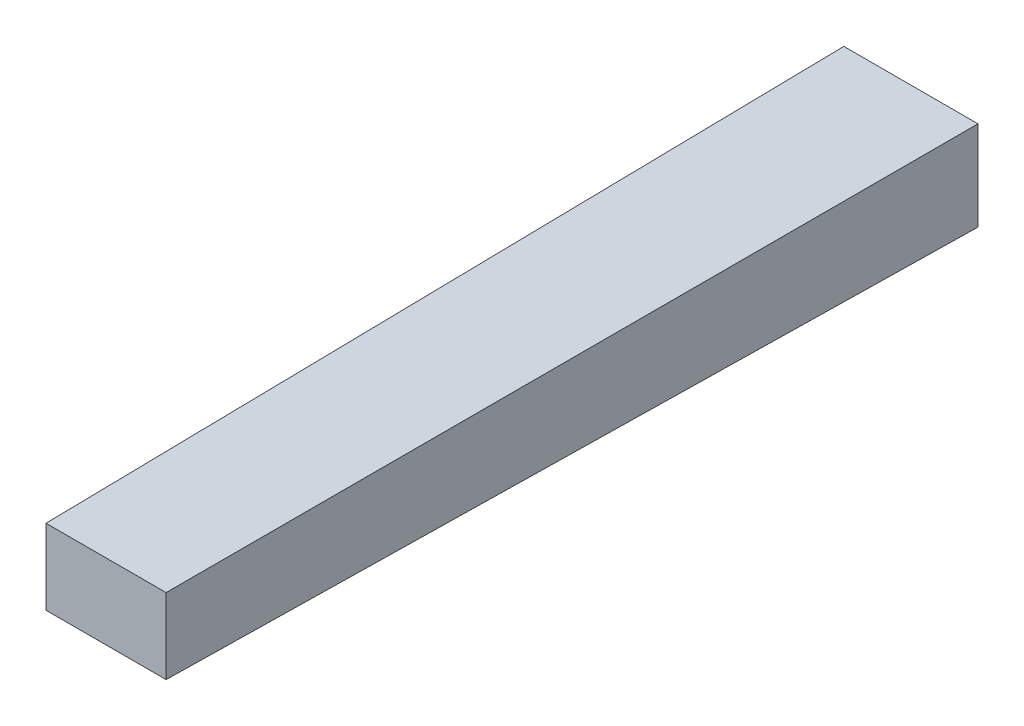
ISO-10303-21;
HEADER;
FILE_DESCRIPTION(('STEP AP214'),'2;1');
FILE_NAME('part.step','',(''),(''),'','','');
FILE_SCHEMA(('AUTOMOTIVE_DESIGN { 1 0 10303 214 1 1 1 1 }'));
ENDSEC;
DATA;
#1=APPLICATION_CONTEXT('core data for automotive mechanical design processes');
#2=APPLICATION_PROTOCOL_DEFINITION('international standard','automotive_design',2000,#1);
#3=PRODUCT_CONTEXT('',#1,'mechanical');
#4=PRODUCT('Part','Part','',(#3));
#5=PRODUCT_RELATED_PRODUCT_CATEGORY('part','',(#4));
#6=PRODUCT_DEFINITION_FORMATION('','',#4);
#7=PRODUCT_DEFINITION_CONTEXT('part definition',#1,'design');
#8=PRODUCT_DEFINITION('design','',#6,#7);
#9=PRODUCT_DEFINITION_SHAPE('','',#8);
#10=(LENGTH_UNIT() NAMED_UNIT(*) SI_UNIT(.MILLI.,.METRE.));
#11=(NAMED_UNIT(*) PLANE_ANGLE_UNIT() SI_UNIT($,.RADIAN.));
#12=(NAMED_UNIT(*) SI_UNIT($,.STERADIAN.) SOLID_ANGLE_UNIT());
#13=UNCERTAINTY_MEASURE_WITH_UNIT(LENGTH_MEASURE(1.E-05),#10,'distance_accuracy_value','');
#14=(GEOMETRIC_REPRESENTATION_CONTEXT(3) GLOBAL_UNCERTAINTY_ASSIGNED_CONTEXT((#13)) GLOBAL_UNIT_ASSIGNED_CONTEXT((#10,
#11,#12)) REPRESENTATION_CONTEXT('',''));
#15=CARTESIAN_POINT('',(0.,0.,0.));
#16=DIRECTION('',(0.,0.,1.));
#17=DIRECTION('',(1.,0.,0.));
#18=AXIS2_PLACEMENT_3D('',#15,#16,#17);
#19=CARTESIAN_POINT('',(0.,0.,0.));
#20=DIRECTION('',(-0.999961923064171,0.,0.00872653549837395));
#21=DIRECTION('',(0.00872653549837395,0.,0.999961923064171));
#22=AXIS2_PLACEMENT_3D('',#19,#20,#21);
#23=PLANE('',#22);
#24=DIRECTION('',(0.,-1.,0.));
#25=VECTOR('',#24,1.);
#26=CARTESIAN_POINT('',(0.,0.,0.));
#27=LINE('',#26,#25);
#28=CARTESIAN_POINT('',(0.,6.,0.));
#29=VERTEX_POINT('',#28);
#30=CARTESIAN_POINT('',(0.,0.,0.));
#31=VERTEX_POINT('',#30);
#32=EDGE_CURVE('E90',#29,#31,#27,.T.);
#33=ORIENTED_EDGE('',*,*,#32,.T.);
#34=DIRECTION('',(-0.00872620324394424,-0.00872620324394424,-0.99992385047757));
#35=VECTOR('',#34,1.);
#36=CARTESIAN_POINT('',(0.,0.,0.));
#37=LINE('',#36,#35);
#38=CARTESIAN_POINT('',(0.471250860700976,0.471250860700976,54.));
#39=VERTEX_POINT('',#38);
#40=EDGE_CURVE('E11',#39,#31,#37,.T.);
#41=ORIENTED_EDGE('',*,*,#40,.F.);
#42=DIRECTION('',(0.,1.,0.));
#43=VECTOR('',#42,1.);
#44=CARTESIAN_POINT('',(0.471250860700976,0.,54.));
#45=LINE('',#44,#43);
#46=CARTESIAN_POINT('',(0.471250860700976,5.52874913929903,54.));
#47=VERTEX_POINT('',#46);
#48=EDGE_CURVE('E110',#47,#39,#45,.F.);
#49=ORIENTED_EDGE('',*,*,#48,.F.);
#50=DIRECTION('',(-0.00872620324394424,0.00872620324394424,-0.99992385047757));
#51=VECTOR('',#50,1.);
#52=CARTESIAN_POINT('',(0.000456879738327737,5.99954312026167,0.0523532324864075));
#53=LINE('',#52,#51);
#54=EDGE_CURVE('E102',#47,#29,#53,.T.);
#55=ORIENTED_EDGE('',*,*,#54,.T.);
#56=EDGE_LOOP('',(#33,#41,#49,#55));
#57=FACE_BOUND('',#56,.T.);
#58=ADVANCED_FACE('F43',(#57),#23,.T.);
#59=CARTESIAN_POINT('',(0.,0.,0.));
#60=DIRECTION('',(0.,-0.999961923064171,0.00872653549837395));
#61=DIRECTION('',(0.,-0.00872653549837395,-0.999961923064171));
#62=AXIS2_PLACEMENT_3D('',#59,#60,#61);
#63=PLANE('',#62);
#64=DIRECTION('',(1.,0.,0.));
#65=VECTOR('',#64,1.);
#66=CARTESIAN_POINT('',(0.,0.,0.));
#67=LINE('',#66,#65);
#68=CARTESIAN_POINT('',(9.,0.,0.));
#69=VERTEX_POINT('',#68);
#70=EDGE_CURVE('E86',#31,#69,#67,.T.);
#71=ORIENTED_EDGE('',*,*,#70,.T.);
#72=DIRECTION('',(0.00872620324394424,-0.00872620324394424,-0.99992385047757));
#73=VECTOR('',#72,1.);
#74=CARTESIAN_POINT('',(9.,0.,0.));
#75=LINE('',#74,#73);
#76=CARTESIAN_POINT('',(8.52874913929902,0.471250860700976,54.));
#77=VERTEX_POINT('',#76);
#78=EDGE_CURVE('E53',#77,#69,#75,.T.);
#79=ORIENTED_EDGE('',*,*,#78,.F.);
#80=DIRECTION('',(-1.,0.,0.));
#81=VECTOR('',#80,1.);
#82=CARTESIAN_POINT('',(0.,0.471250860700976,54.));
#83=LINE('',#82,#81);
#84=EDGE_CURVE('E98',#39,#77,#83,.F.);
#85=ORIENTED_EDGE('',*,*,#84,.F.);
#86=ORIENTED_EDGE('',*,*,#40,.T.);
#87=EDGE_LOOP('',(#71,#79,#85,#86));
#88=FACE_BOUND('',#87,.T.);
#89=ADVANCED_FACE('F45',(#88),#63,.T.);
#90=CARTESIAN_POINT('',(9.,0.,0.));
#91=DIRECTION('',(0.999961923064171,0.,0.00872653549837395));
#92=DIRECTION('',(0.00872653549837395,0.,-0.999961923064171));
#93=AXIS2_PLACEMENT_3D('',#90,#91,#92);
#94=PLANE('',#93);
#95=DIRECTION('',(0.,1.,0.));
#96=VECTOR('',#95,1.);
#97=CARTESIAN_POINT('',(9.,0.,0.));
#98=LINE('',#97,#96);
#99=CARTESIAN_POINT('',(9.,6.,0.));
#100=VERTEX_POINT('',#99);
#101=EDGE_CURVE('E91',#69,#100,#98,.T.);
#102=ORIENTED_EDGE('',*,*,#101,.T.);
#103=DIRECTION('',(0.00872620324394424,0.00872620324394424,-0.99992385047757));
#104=VECTOR('',#103,1.);
#105=CARTESIAN_POINT('',(8.99931468039251,5.99931468039251,0.0785298487296113));
#106=LINE('',#105,#104);
#107=CARTESIAN_POINT('',(8.52874913929902,5.52874913929903,54.));
#108=VERTEX_POINT('',#107);
#109=EDGE_CURVE('E114',#108,#100,#106,.T.);
#110=ORIENTED_EDGE('',*,*,#109,.F.);
#111=DIRECTION('',(0.,-1.,0.));
#112=VECTOR('',#111,1.);
#113=CARTESIAN_POINT('',(8.52874913929902,0.,54.));
#114=LINE('',#113,#112);
#115=EDGE_CURVE('E65',#77,#108,#114,.F.);
#116=ORIENTED_EDGE('',*,*,#115,.F.);
#117=ORIENTED_EDGE('',*,*,#78,.T.);
#118=EDGE_LOOP('',(#102,#110,#116,#117));
#119=FACE_BOUND('',#118,.T.);
#120=ADVANCED_FACE('F127',(#119),#94,.T.);
#121=CARTESIAN_POINT('',(0.,6.,0.));
#122=DIRECTION('',(0.,0.999961923064171,0.00872653549837395));
#123=DIRECTION('',(0.,-0.00872653549837395,0.999961923064171));
#124=AXIS2_PLACEMENT_3D('',#121,#122,#123);
#125=PLANE('',#124);
#126=DIRECTION('',(-1.,0.,0.));
#127=VECTOR('',#126,1.);
#128=CARTESIAN_POINT('',(0.,6.,0.));
#129=LINE('',#128,#127);
#130=EDGE_CURVE('E108',#100,#29,#129,.T.);
#131=ORIENTED_EDGE('',*,*,#130,.T.);
#132=ORIENTED_EDGE('',*,*,#54,.F.);
#133=DIRECTION('',(1.,0.,0.));
#134=VECTOR('',#133,1.);
#135=CARTESIAN_POINT('',(0.,5.52874913929903,54.));
#136=LINE('',#135,#134);
#137=EDGE_CURVE('E47',#108,#47,#136,.F.);
#138=ORIENTED_EDGE('',*,*,#137,.F.);
#139=ORIENTED_EDGE('',*,*,#109,.T.);
#140=EDGE_LOOP('',(#131,#132,#138,#139));
#141=FACE_BOUND('',#140,.T.);
#142=ADVANCED_FACE('F129',(#141),#125,.T.);
#143=CARTESIAN_POINT('',(0.,0.,54.));
#144=DIRECTION('',(0.,0.,-1.));
#145=DIRECTION('',(-1.,0.,0.));
#146=AXIS2_PLACEMENT_3D('',#143,#144,#145);
#147=PLANE('',#146);
#148=ORIENTED_EDGE('',*,*,#48,.T.);
#149=ORIENTED_EDGE('',*,*,#84,.T.);
#150=ORIENTED_EDGE('',*,*,#115,.T.);
#151=ORIENTED_EDGE('',*,*,#137,.T.);
#152=EDGE_LOOP('',(#148,#149,#150,#151));
#153=FACE_BOUND('',#152,.T.);
#154=ADVANCED_FACE('F125',(#153),#147,.F.);
#155=CARTESIAN_POINT('',(0.,0.,0.));
#156=DIRECTION('',(0.,0.,-1.));
#157=DIRECTION('',(-1.,0.,0.));
#158=AXIS2_PLACEMENT_3D('',#155,#156,#157);
#159=PLANE('',#158);
#160=ORIENTED_EDGE('',*,*,#32,.F.);
#161=ORIENTED_EDGE('',*,*,#130,.F.);
#162=ORIENTED_EDGE('',*,*,#101,.F.);
#163=ORIENTED_EDGE('',*,*,#70,.F.);
#164=EDGE_LOOP('',(#160,#161,#162,#163));
#165=FACE_BOUND('',#164,.T.);
#166=ADVANCED_FACE('F87',(#165),#159,.T.);
#167=CLOSED_SHELL('',(#58,#89,#120,#142,#154,#166));
#168=MANIFOLD_SOLID_BREP('B2',#167);
#169=ADVANCED_BREP_SHAPE_REPRESENTATION('',(#18,#168),#14);
#170=SHAPE_DEFINITION_REPRESENTATION(#9,#169);
ENDSEC;
END-ISO-10303-21;
